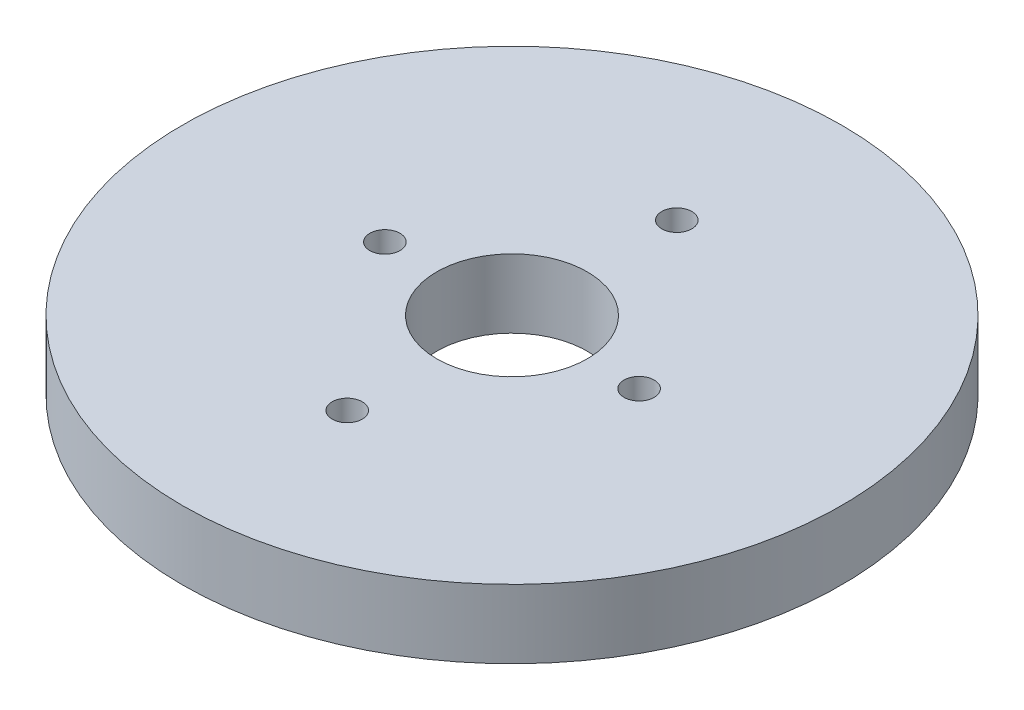
ISO-10303-21;
HEADER;
FILE_DESCRIPTION(('STEP AP214'),'2;1');
FILE_NAME('part.step','',(''),(''),'','','');
FILE_SCHEMA(('AUTOMOTIVE_DESIGN { 1 0 10303 214 1 1 1 1 }'));
ENDSEC;
DATA;
#1=APPLICATION_CONTEXT('core data for automotive mechanical design processes');
#2=APPLICATION_PROTOCOL_DEFINITION('international standard','automotive_design',2000,#1);
#3=PRODUCT_CONTEXT('',#1,'mechanical');
#4=PRODUCT('Part','Part','',(#3));
#5=PRODUCT_RELATED_PRODUCT_CATEGORY('part','',(#4));
#6=PRODUCT_DEFINITION_FORMATION('','',#4);
#7=PRODUCT_DEFINITION_CONTEXT('part definition',#1,'design');
#8=PRODUCT_DEFINITION('design','',#6,#7);
#9=PRODUCT_DEFINITION_SHAPE('','',#8);
#10=(LENGTH_UNIT() NAMED_UNIT(*) SI_UNIT(.MILLI.,.METRE.));
#11=(NAMED_UNIT(*) PLANE_ANGLE_UNIT() SI_UNIT($,.RADIAN.));
#12=(NAMED_UNIT(*) SI_UNIT($,.STERADIAN.) SOLID_ANGLE_UNIT());
#13=UNCERTAINTY_MEASURE_WITH_UNIT(LENGTH_MEASURE(1.E-05),#10,'distance_accuracy_value','');
#14=(GEOMETRIC_REPRESENTATION_CONTEXT(3) GLOBAL_UNCERTAINTY_ASSIGNED_CONTEXT((#13)) GLOBAL_UNIT_ASSIGNED_CONTEXT((#10,
#11,#12)) REPRESENTATION_CONTEXT('',''));
#15=CARTESIAN_POINT('',(0.,0.,0.));
#16=DIRECTION('',(0.,0.,1.));
#17=DIRECTION('',(1.,0.,0.));
#18=AXIS2_PLACEMENT_3D('',#15,#16,#17);
#19=CARTESIAN_POINT('',(0.,3.65,0.));
#20=DIRECTION('',(0.,1.,0.));
#21=DIRECTION('',(0.,0.,1.));
#22=AXIS2_PLACEMENT_3D('',#19,#20,#21);
#23=PLANE('',#22);
#24=CARTESIAN_POINT('',(6.75,3.65,0.));
#25=DIRECTION('',(0.,1.,0.));
#26=DIRECTION('',(0.,0.,1.));
#27=AXIS2_PLACEMENT_3D('',#24,#25,#26);
#28=CIRCLE('',#27,0.8);
#29=CARTESIAN_POINT('',(6.75,3.65,0.800000000000046));
#30=VERTEX_POINT('',#29);
#31=EDGE_CURVE('E62',#30,#30,#28,.T.);
#32=ORIENTED_EDGE('',*,*,#31,.F.);
#33=EDGE_LOOP('',(#32));
#34=FACE_BOUND('',#33,.T.);
#35=CARTESIAN_POINT('',(-6.75,3.65,0.));
#36=DIRECTION('',(0.,1.,0.));
#37=DIRECTION('',(0.,0.,1.));
#38=AXIS2_PLACEMENT_3D('',#35,#36,#37);
#39=CIRCLE('',#38,0.8);
#40=CARTESIAN_POINT('',(-6.75,3.65,0.800000000000001));
#41=VERTEX_POINT('',#40);
#42=EDGE_CURVE('E50',#41,#41,#39,.T.);
#43=ORIENTED_EDGE('',*,*,#42,.F.);
#44=EDGE_LOOP('',(#43));
#45=FACE_BOUND('',#44,.T.);
#46=CARTESIAN_POINT('',(0.,3.65,0.));
#47=DIRECTION('',(0.,1.,0.));
#48=DIRECTION('',(0.,0.,1.));
#49=AXIS2_PLACEMENT_3D('',#46,#47,#48);
#50=CIRCLE('',#49,17.5);
#51=CARTESIAN_POINT('',(0.,3.65,17.5));
#52=VERTEX_POINT('',#51);
#53=EDGE_CURVE('E10',#52,#52,#50,.T.);
#54=ORIENTED_EDGE('',*,*,#53,.T.);
#55=EDGE_LOOP('',(#54));
#56=FACE_BOUND('',#55,.T.);
#57=CARTESIAN_POINT('',(0.,3.65,0.));
#58=DIRECTION('',(0.,1.,0.));
#59=DIRECTION('',(0.,0.,1.));
#60=AXIS2_PLACEMENT_3D('',#57,#58,#59);
#61=CIRCLE('',#60,4.);
#62=CARTESIAN_POINT('',(0.,3.65,4.));
#63=VERTEX_POINT('',#62);
#64=EDGE_CURVE('E45',#63,#63,#61,.T.);
#65=ORIENTED_EDGE('',*,*,#64,.F.);
#66=EDGE_LOOP('',(#65));
#67=FACE_BOUND('',#66,.T.);
#68=CARTESIAN_POINT('',(0.,3.65,8.75));
#69=DIRECTION('',(0.,1.,0.));
#70=DIRECTION('',(0.,0.,1.));
#71=AXIS2_PLACEMENT_3D('',#68,#69,#70);
#72=CIRCLE('',#71,0.8);
#73=CARTESIAN_POINT('',(0.,3.65,9.55));
#74=VERTEX_POINT('',#73);
#75=EDGE_CURVE('E56',#74,#74,#72,.T.);
#76=ORIENTED_EDGE('',*,*,#75,.F.);
#77=EDGE_LOOP('',(#76));
#78=FACE_BOUND('',#77,.T.);
#79=CARTESIAN_POINT('',(0.,3.65,-8.75));
#80=DIRECTION('',(0.,1.,0.));
#81=DIRECTION('',(0.,0.,1.));
#82=AXIS2_PLACEMENT_3D('',#79,#80,#81);
#83=CIRCLE('',#82,0.8);
#84=CARTESIAN_POINT('',(0.,3.65,-7.95));
#85=VERTEX_POINT('',#84);
#86=EDGE_CURVE('E68',#85,#85,#83,.T.);
#87=ORIENTED_EDGE('',*,*,#86,.F.);
#88=EDGE_LOOP('',(#87));
#89=FACE_BOUND('',#88,.T.);
#90=ADVANCED_FACE('F34',(#34,#45,#56,#67,#78,#89),#23,.T.);
#91=CARTESIAN_POINT('',(0.,0.,0.));
#92=DIRECTION('',(0.,1.,0.));
#93=DIRECTION('',(0.,0.,1.));
#94=AXIS2_PLACEMENT_3D('',#91,#92,#93);
#95=PLANE('',#94);
#96=CARTESIAN_POINT('',(0.,0.,0.));
#97=DIRECTION('',(0.,1.,0.));
#98=DIRECTION('',(0.,0.,1.));
#99=AXIS2_PLACEMENT_3D('',#96,#97,#98);
#100=CIRCLE('',#99,17.5);
#101=CARTESIAN_POINT('',(0.,0.,17.5));
#102=VERTEX_POINT('',#101);
#103=EDGE_CURVE('E38',#102,#102,#100,.T.);
#104=ORIENTED_EDGE('',*,*,#103,.F.);
#105=EDGE_LOOP('',(#104));
#106=FACE_BOUND('',#105,.T.);
#107=CARTESIAN_POINT('',(0.,0.,0.));
#108=DIRECTION('',(0.,1.,0.));
#109=DIRECTION('',(0.,0.,1.));
#110=AXIS2_PLACEMENT_3D('',#107,#108,#109);
#111=CIRCLE('',#110,4.);
#112=CARTESIAN_POINT('',(0.,0.,4.));
#113=VERTEX_POINT('',#112);
#114=EDGE_CURVE('E47',#113,#113,#111,.T.);
#115=ORIENTED_EDGE('',*,*,#114,.T.);
#116=EDGE_LOOP('',(#115));
#117=FACE_BOUND('',#116,.T.);
#118=CARTESIAN_POINT('',(-6.75,0.,0.));
#119=DIRECTION('',(0.,1.,0.));
#120=DIRECTION('',(0.,0.,1.));
#121=AXIS2_PLACEMENT_3D('',#118,#119,#120);
#122=CIRCLE('',#121,0.8);
#123=CARTESIAN_POINT('',(-6.75,0.,0.800000000000001));
#124=VERTEX_POINT('',#123);
#125=EDGE_CURVE('E53',#124,#124,#122,.T.);
#126=ORIENTED_EDGE('',*,*,#125,.T.);
#127=EDGE_LOOP('',(#126));
#128=FACE_BOUND('',#127,.T.);
#129=CARTESIAN_POINT('',(0.,0.,8.75));
#130=DIRECTION('',(0.,1.,0.));
#131=DIRECTION('',(0.,0.,1.));
#132=AXIS2_PLACEMENT_3D('',#129,#130,#131);
#133=CIRCLE('',#132,0.8);
#134=CARTESIAN_POINT('',(0.,0.,9.55));
#135=VERTEX_POINT('',#134);
#136=EDGE_CURVE('E59',#135,#135,#133,.T.);
#137=ORIENTED_EDGE('',*,*,#136,.T.);
#138=EDGE_LOOP('',(#137));
#139=FACE_BOUND('',#138,.T.);
#140=CARTESIAN_POINT('',(6.75,0.,0.));
#141=DIRECTION('',(0.,1.,0.));
#142=DIRECTION('',(0.,0.,1.));
#143=AXIS2_PLACEMENT_3D('',#140,#141,#142);
#144=CIRCLE('',#143,0.8);
#145=CARTESIAN_POINT('',(6.75,0.,0.800000000000046));
#146=VERTEX_POINT('',#145);
#147=EDGE_CURVE('E65',#146,#146,#144,.T.);
#148=ORIENTED_EDGE('',*,*,#147,.T.);
#149=EDGE_LOOP('',(#148));
#150=FACE_BOUND('',#149,.T.);
#151=CARTESIAN_POINT('',(0.,0.,-8.75));
#152=DIRECTION('',(0.,1.,0.));
#153=DIRECTION('',(0.,0.,1.));
#154=AXIS2_PLACEMENT_3D('',#151,#152,#153);
#155=CIRCLE('',#154,0.8);
#156=CARTESIAN_POINT('',(0.,0.,-7.95));
#157=VERTEX_POINT('',#156);
#158=EDGE_CURVE('E71',#157,#157,#155,.T.);
#159=ORIENTED_EDGE('',*,*,#158,.T.);
#160=EDGE_LOOP('',(#159));
#161=FACE_BOUND('',#160,.T.);
#162=ADVANCED_FACE('F81',(#106,#117,#128,#139,#150,#161),#95,.F.);
#163=CARTESIAN_POINT('',(0.,3.65,0.));
#164=DIRECTION('',(0.,-1.,0.));
#165=DIRECTION('',(0.,0.,-1.));
#166=AXIS2_PLACEMENT_3D('',#163,#164,#165);
#167=CYLINDRICAL_SURFACE('',#166,17.5);
#168=ORIENTED_EDGE('',*,*,#53,.F.);
#169=EDGE_LOOP('',(#168));
#170=FACE_BOUND('',#169,.T.);
#171=ORIENTED_EDGE('',*,*,#103,.T.);
#172=EDGE_LOOP('',(#171));
#173=FACE_BOUND('',#172,.T.);
#174=ADVANCED_FACE('F36',(#170,#173),#167,.T.);
#175=CARTESIAN_POINT('',(0.,3.65,0.));
#176=DIRECTION('',(0.,-1.,0.));
#177=DIRECTION('',(0.,0.,-1.));
#178=AXIS2_PLACEMENT_3D('',#175,#176,#177);
#179=CYLINDRICAL_SURFACE('',#178,4.);
#180=ORIENTED_EDGE('',*,*,#64,.T.);
#181=EDGE_LOOP('',(#180));
#182=FACE_BOUND('',#181,.T.);
#183=ORIENTED_EDGE('',*,*,#114,.F.);
#184=EDGE_LOOP('',(#183));
#185=FACE_BOUND('',#184,.T.);
#186=ADVANCED_FACE('F91',(#182,#185),#179,.F.);
#187=CARTESIAN_POINT('',(-6.75,3.65,0.));
#188=DIRECTION('',(0.,-1.,0.));
#189=DIRECTION('',(0.,0.,-1.));
#190=AXIS2_PLACEMENT_3D('',#187,#188,#189);
#191=CYLINDRICAL_SURFACE('',#190,0.8);
#192=ORIENTED_EDGE('',*,*,#42,.T.);
#193=EDGE_LOOP('',(#192));
#194=FACE_BOUND('',#193,.T.);
#195=ORIENTED_EDGE('',*,*,#125,.F.);
#196=EDGE_LOOP('',(#195));
#197=FACE_BOUND('',#196,.T.);
#198=ADVANCED_FACE('F94',(#194,#197),#191,.F.);
#199=CARTESIAN_POINT('',(0.,3.65,8.75));
#200=DIRECTION('',(0.,-1.,0.));
#201=DIRECTION('',(0.,0.,-1.));
#202=AXIS2_PLACEMENT_3D('',#199,#200,#201);
#203=CYLINDRICAL_SURFACE('',#202,0.8);
#204=ORIENTED_EDGE('',*,*,#75,.T.);
#205=EDGE_LOOP('',(#204));
#206=FACE_BOUND('',#205,.T.);
#207=ORIENTED_EDGE('',*,*,#136,.F.);
#208=EDGE_LOOP('',(#207));
#209=FACE_BOUND('',#208,.T.);
#210=ADVANCED_FACE('F98',(#206,#209),#203,.F.);
#211=CARTESIAN_POINT('',(6.75,3.65,0.));
#212=DIRECTION('',(0.,-1.,0.));
#213=DIRECTION('',(0.,0.,-1.));
#214=AXIS2_PLACEMENT_3D('',#211,#212,#213);
#215=CYLINDRICAL_SURFACE('',#214,0.8);
#216=ORIENTED_EDGE('',*,*,#31,.T.);
#217=EDGE_LOOP('',(#216));
#218=FACE_BOUND('',#217,.T.);
#219=ORIENTED_EDGE('',*,*,#147,.F.);
#220=EDGE_LOOP('',(#219));
#221=FACE_BOUND('',#220,.T.);
#222=ADVANCED_FACE('F102',(#218,#221),#215,.F.);
#223=CARTESIAN_POINT('',(0.,3.65,-8.75));
#224=DIRECTION('',(0.,-1.,0.));
#225=DIRECTION('',(0.,0.,-1.));
#226=AXIS2_PLACEMENT_3D('',#223,#224,#225);
#227=CYLINDRICAL_SURFACE('',#226,0.8);
#228=ORIENTED_EDGE('',*,*,#86,.T.);
#229=EDGE_LOOP('',(#228));
#230=FACE_BOUND('',#229,.T.);
#231=ORIENTED_EDGE('',*,*,#158,.F.);
#232=EDGE_LOOP('',(#231));
#233=FACE_BOUND('',#232,.T.);
#234=ADVANCED_FACE('F77',(#230,#233),#227,.F.);
#235=CLOSED_SHELL('',(#90,#162,#174,#186,#198,#210,#222,#234));
#236=MANIFOLD_SOLID_BREP('B2',#235);
#237=ADVANCED_BREP_SHAPE_REPRESENTATION('',(#18,#236),#14);
#238=SHAPE_DEFINITION_REPRESENTATION(#9,#237);
ENDSEC;
END-ISO-10303-21;
